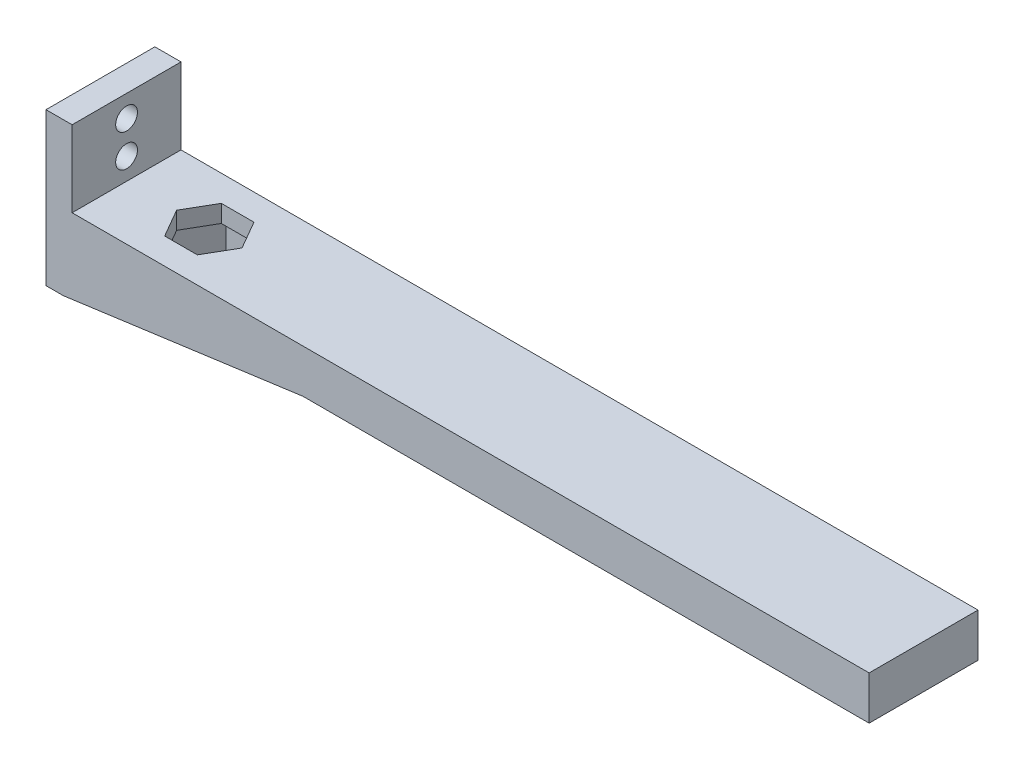
ISO-10303-21;
HEADER;
FILE_DESCRIPTION(('STEP AP214'),'2;1');
FILE_NAME('part.step','',(''),(''),'','','');
FILE_SCHEMA(('AUTOMOTIVE_DESIGN { 1 0 10303 214 1 1 1 1 }'));
ENDSEC;
DATA;
#1=APPLICATION_CONTEXT('core data for automotive mechanical design processes');
#2=APPLICATION_PROTOCOL_DEFINITION('international standard','automotive_design',2000,#1);
#3=PRODUCT_CONTEXT('',#1,'mechanical');
#4=PRODUCT('Part','Part','',(#3));
#5=PRODUCT_RELATED_PRODUCT_CATEGORY('part','',(#4));
#6=PRODUCT_DEFINITION_FORMATION('','',#4);
#7=PRODUCT_DEFINITION_CONTEXT('part definition',#1,'design');
#8=PRODUCT_DEFINITION('design','',#6,#7);
#9=PRODUCT_DEFINITION_SHAPE('','',#8);
#10=(LENGTH_UNIT() NAMED_UNIT(*) SI_UNIT(.MILLI.,.METRE.));
#11=(NAMED_UNIT(*) PLANE_ANGLE_UNIT() SI_UNIT($,.RADIAN.));
#12=(NAMED_UNIT(*) SI_UNIT($,.STERADIAN.) SOLID_ANGLE_UNIT());
#13=UNCERTAINTY_MEASURE_WITH_UNIT(LENGTH_MEASURE(1.E-05),#10,'distance_accuracy_value','');
#14=(GEOMETRIC_REPRESENTATION_CONTEXT(3) GLOBAL_UNCERTAINTY_ASSIGNED_CONTEXT((#13)) GLOBAL_UNIT_ASSIGNED_CONTEXT((#10,
#11,#12)) REPRESENTATION_CONTEXT('',''));
#15=CARTESIAN_POINT('',(0.,0.,0.));
#16=DIRECTION('',(0.,0.,1.));
#17=DIRECTION('',(1.,0.,0.));
#18=AXIS2_PLACEMENT_3D('',#15,#16,#17);
#19=CARTESIAN_POINT('',(4.,20.3125,8.17307692307693));
#20=DIRECTION('',(0.,0.,-1.));
#21=DIRECTION('',(0.,1.,0.));
#22=AXIS2_PLACEMENT_3D('',#19,#20,#21);
#23=PLANE('',#22);
#24=DIRECTION('',(-1.,0.,0.));
#25=VECTOR('',#24,1.);
#26=CARTESIAN_POINT('',(4.,-14.6875,8.17307692307692));
#27=LINE('',#26,#25);
#28=CARTESIAN_POINT('',(4.,-14.6875,8.17307692307693));
#29=VERTEX_POINT('',#28);
#30=CARTESIAN_POINT('',(0.,-14.6875,8.17307692307692));
#31=VERTEX_POINT('',#30);
#32=EDGE_CURVE('E332',#29,#31,#27,.T.);
#33=ORIENTED_EDGE('',*,*,#32,.F.);
#34=DIRECTION('',(0.990830168044299,0.135113204733314,0.));
#35=VECTOR('',#34,1.);
#36=CARTESIAN_POINT('',(4.,-14.6875,8.17307692307693));
#37=LINE('',#36,#35);
#38=CARTESIAN_POINT('',(59.,-7.1875,8.17307692307693));
#39=VERTEX_POINT('',#38);
#40=EDGE_CURVE('E194',#29,#39,#37,.T.);
#41=ORIENTED_EDGE('',*,*,#40,.T.);
#42=DIRECTION('',(-1.,0.,0.));
#43=VECTOR('',#42,1.);
#44=CARTESIAN_POINT('',(189.,-7.1875,8.17307692307693));
#45=LINE('',#44,#43);
#46=CARTESIAN_POINT('',(189.,-7.1875,8.17307692307693));
#47=VERTEX_POINT('',#46);
#48=EDGE_CURVE('E175',#47,#39,#45,.T.);
#49=ORIENTED_EDGE('',*,*,#48,.F.);
#50=DIRECTION('',(0.,-1.,0.));
#51=VECTOR('',#50,1.);
#52=CARTESIAN_POINT('',(189.,-7.1875,8.17307692307693));
#53=LINE('',#52,#51);
#54=CARTESIAN_POINT('',(189.,2.8125,8.17307692307693));
#55=VERTEX_POINT('',#54);
#56=EDGE_CURVE('E182',#55,#47,#53,.T.);
#57=ORIENTED_EDGE('',*,*,#56,.F.);
#58=DIRECTION('',(-1.,0.,0.));
#59=VECTOR('',#58,1.);
#60=CARTESIAN_POINT('',(59.,2.8125,8.17307692307693));
#61=LINE('',#60,#59);
#62=CARTESIAN_POINT('',(6.,2.8125,8.17307692307693));
#63=VERTEX_POINT('',#62);
#64=EDGE_CURVE('E296',#55,#63,#61,.T.);
#65=ORIENTED_EDGE('',*,*,#64,.T.);
#66=DIRECTION('',(0.,-1.,0.));
#67=VECTOR('',#66,1.);
#68=CARTESIAN_POINT('',(6.,20.3125,8.17307692307693));
#69=LINE('',#68,#67);
#70=CARTESIAN_POINT('',(6.,20.3125,8.17307692307693));
#71=VERTEX_POINT('',#70);
#72=EDGE_CURVE('E300',#71,#63,#69,.T.);
#73=ORIENTED_EDGE('',*,*,#72,.F.);
#74=DIRECTION('',(-1.,0.,0.));
#75=VECTOR('',#74,1.);
#76=CARTESIAN_POINT('',(4.,20.3125,8.17307692307693));
#77=LINE('',#76,#75);
#78=CARTESIAN_POINT('',(0.,20.3125,8.17307692307693));
#79=VERTEX_POINT('',#78);
#80=EDGE_CURVE('E315',#71,#79,#77,.T.);
#81=ORIENTED_EDGE('',*,*,#80,.T.);
#82=DIRECTION('',(0.,-1.,0.));
#83=VECTOR('',#82,1.);
#84=CARTESIAN_POINT('',(0.,20.3125,8.17307692307693));
#85=LINE('',#84,#83);
#86=EDGE_CURVE('E312',#79,#31,#85,.T.);
#87=ORIENTED_EDGE('',*,*,#86,.T.);
#88=EDGE_LOOP('',(#33,#41,#49,#57,#65,#73,#81,#87));
#89=FACE_BOUND('',#88,.T.);
#90=ADVANCED_FACE('F33',(#89),#23,.F.);
#91=CARTESIAN_POINT('',(4.,-14.6875,8.17307692307692));
#92=DIRECTION('',(0.,1.,0.));
#93=DIRECTION('',(0.,0.,1.));
#94=AXIS2_PLACEMENT_3D('',#91,#92,#93);
#95=PLANE('',#94);
#96=DIRECTION('',(0.,0.,-1.));
#97=VECTOR('',#96,1.);
#98=CARTESIAN_POINT('',(0.,-14.6875,8.17307692307692));
#99=LINE('',#98,#97);
#100=CARTESIAN_POINT('',(0.,-14.6875,-16.8269230769231));
#101=VERTEX_POINT('',#100);
#102=EDGE_CURVE('E319',#31,#101,#99,.T.);
#103=ORIENTED_EDGE('',*,*,#102,.T.);
#104=DIRECTION('',(-1.,0.,0.));
#105=VECTOR('',#104,1.);
#106=CARTESIAN_POINT('',(4.,-14.6875,-16.8269230769231));
#107=LINE('',#106,#105);
#108=CARTESIAN_POINT('',(4.,-14.6875,-16.8269230769231));
#109=VERTEX_POINT('',#108);
#110=EDGE_CURVE('E329',#109,#101,#107,.T.);
#111=ORIENTED_EDGE('',*,*,#110,.F.);
#112=DIRECTION('',(0.,0.,-1.));
#113=VECTOR('',#112,1.);
#114=CARTESIAN_POINT('',(4.,-14.6875,8.17307692307692));
#115=LINE('',#114,#113);
#116=EDGE_CURVE('E313',#29,#109,#115,.T.);
#117=ORIENTED_EDGE('',*,*,#116,.F.);
#118=ORIENTED_EDGE('',*,*,#32,.T.);
#119=EDGE_LOOP('',(#103,#111,#117,#118));
#120=FACE_BOUND('',#119,.T.);
#121=ADVANCED_FACE('F389',(#120),#95,.F.);
#122=CARTESIAN_POINT('',(4.,20.3125,-16.8269230769231));
#123=DIRECTION('',(0.,0.,1.));
#124=DIRECTION('',(1.,0.,0.));
#125=AXIS2_PLACEMENT_3D('',#122,#123,#124);
#126=PLANE('',#125);
#127=DIRECTION('',(0.,1.,0.));
#128=VECTOR('',#127,1.);
#129=CARTESIAN_POINT('',(0.,20.3125,-16.8269230769231));
#130=LINE('',#129,#128);
#131=CARTESIAN_POINT('',(0.,20.3125,-16.8269230769231));
#132=VERTEX_POINT('',#131);
#133=EDGE_CURVE('E321',#101,#132,#130,.T.);
#134=ORIENTED_EDGE('',*,*,#133,.T.);
#135=DIRECTION('',(-1.,0.,0.));
#136=VECTOR('',#135,1.);
#137=CARTESIAN_POINT('',(4.,20.3125,-16.8269230769231));
#138=LINE('',#137,#136);
#139=CARTESIAN_POINT('',(6.,20.3125,-16.8269230769231));
#140=VERTEX_POINT('',#139);
#141=EDGE_CURVE('E326',#140,#132,#138,.T.);
#142=ORIENTED_EDGE('',*,*,#141,.F.);
#143=DIRECTION('',(0.,1.,0.));
#144=VECTOR('',#143,1.);
#145=CARTESIAN_POINT('',(6.,20.3125,-16.8269230769231));
#146=LINE('',#145,#144);
#147=CARTESIAN_POINT('',(6.,2.8125,-16.8269230769231));
#148=VERTEX_POINT('',#147);
#149=EDGE_CURVE('E306',#148,#140,#146,.T.);
#150=ORIENTED_EDGE('',*,*,#149,.F.);
#151=DIRECTION('',(-1.,0.,0.));
#152=VECTOR('',#151,1.);
#153=CARTESIAN_POINT('',(59.,2.8125,-16.8269230769231));
#154=LINE('',#153,#152);
#155=CARTESIAN_POINT('',(189.,2.8125,-16.8269230769231));
#156=VERTEX_POINT('',#155);
#157=EDGE_CURVE('E298',#156,#148,#154,.T.);
#158=ORIENTED_EDGE('',*,*,#157,.F.);
#159=DIRECTION('',(0.,1.,0.));
#160=VECTOR('',#159,1.);
#161=CARTESIAN_POINT('',(189.,-7.1875,-16.8269230769231));
#162=LINE('',#161,#160);
#163=CARTESIAN_POINT('',(189.,-7.1875,-16.8269230769231));
#164=VERTEX_POINT('',#163);
#165=EDGE_CURVE('E181',#164,#156,#162,.T.);
#166=ORIENTED_EDGE('',*,*,#165,.F.);
#167=DIRECTION('',(-1.,0.,0.));
#168=VECTOR('',#167,1.);
#169=CARTESIAN_POINT('',(189.,-7.1875,-16.8269230769231));
#170=LINE('',#169,#168);
#171=CARTESIAN_POINT('',(59.,-7.1875,-16.8269230769231));
#172=VERTEX_POINT('',#171);
#173=EDGE_CURVE('E177',#164,#172,#170,.T.);
#174=ORIENTED_EDGE('',*,*,#173,.T.);
#175=DIRECTION('',(0.990830168044299,0.135113204733314,0.));
#176=VECTOR('',#175,1.);
#177=CARTESIAN_POINT('',(4.,-14.6875,-16.8269230769231));
#178=LINE('',#177,#176);
#179=EDGE_CURVE('E279',#109,#172,#178,.T.);
#180=ORIENTED_EDGE('',*,*,#179,.F.);
#181=ORIENTED_EDGE('',*,*,#110,.T.);
#182=EDGE_LOOP('',(#134,#142,#150,#158,#166,#174,#180,#181));
#183=FACE_BOUND('',#182,.T.);
#184=ADVANCED_FACE('F393',(#183),#126,.F.);
#185=CARTESIAN_POINT('',(4.,20.3125,8.17307692307693));
#186=DIRECTION('',(0.,-1.,0.));
#187=DIRECTION('',(0.,0.,-1.));
#188=AXIS2_PLACEMENT_3D('',#185,#186,#187);
#189=PLANE('',#188);
#190=DIRECTION('',(0.,0.,1.));
#191=VECTOR('',#190,1.);
#192=CARTESIAN_POINT('',(0.,20.3125,8.17307692307693));
#193=LINE('',#192,#191);
#194=EDGE_CURVE('E316',#132,#79,#193,.T.);
#195=ORIENTED_EDGE('',*,*,#194,.T.);
#196=ORIENTED_EDGE('',*,*,#80,.F.);
#197=DIRECTION('',(0.,0.,1.));
#198=VECTOR('',#197,1.);
#199=CARTESIAN_POINT('',(6.,20.3125,8.17307692307693));
#200=LINE('',#199,#198);
#201=EDGE_CURVE('E309',#140,#71,#200,.T.);
#202=ORIENTED_EDGE('',*,*,#201,.F.);
#203=ORIENTED_EDGE('',*,*,#141,.T.);
#204=EDGE_LOOP('',(#195,#196,#202,#203));
#205=FACE_BOUND('',#204,.T.);
#206=ADVANCED_FACE('F398',(#205),#189,.F.);
#207=CARTESIAN_POINT('',(0.,0.,0.));
#208=DIRECTION('',(1.,0.,0.));
#209=DIRECTION('',(0.,0.,-1.));
#210=AXIS2_PLACEMENT_3D('',#207,#208,#209);
#211=PLANE('',#210);
#212=CARTESIAN_POINT('',(0.,15.3125,-4.32692307692307));
#213=DIRECTION('',(1.,0.,0.));
#214=DIRECTION('',(0.,0.,-1.));
#215=AXIS2_PLACEMENT_3D('',#212,#213,#214);
#216=CIRCLE('',#215,2.5);
#217=CARTESIAN_POINT('',(0.,15.3125,-6.82692307692307));
#218=VERTEX_POINT('',#217);
#219=EDGE_CURVE('E291',#218,#218,#216,.T.);
#220=ORIENTED_EDGE('',*,*,#219,.T.);
#221=EDGE_LOOP('',(#220));
#222=FACE_BOUND('',#221,.T.);
#223=CARTESIAN_POINT('',(0.,7.8125,-4.32692307692307));
#224=DIRECTION('',(1.,0.,0.));
#225=DIRECTION('',(0.,0.,-1.));
#226=AXIS2_PLACEMENT_3D('',#223,#224,#225);
#227=CIRCLE('',#226,2.5);
#228=CARTESIAN_POINT('',(0.,7.8125,-6.82692307692307));
#229=VERTEX_POINT('',#228);
#230=EDGE_CURVE('E286',#229,#229,#227,.T.);
#231=ORIENTED_EDGE('',*,*,#230,.T.);
#232=EDGE_LOOP('',(#231));
#233=FACE_BOUND('',#232,.T.);
#234=ORIENTED_EDGE('',*,*,#86,.F.);
#235=ORIENTED_EDGE('',*,*,#194,.F.);
#236=ORIENTED_EDGE('',*,*,#133,.F.);
#237=ORIENTED_EDGE('',*,*,#102,.F.);
#238=EDGE_LOOP('',(#234,#235,#236,#237));
#239=FACE_BOUND('',#238,.T.);
#240=ADVANCED_FACE('F404',(#222,#233,#239),#211,.F.);
#241=CARTESIAN_POINT('',(6.,0.,0.));
#242=DIRECTION('',(1.,0.,0.));
#243=DIRECTION('',(0.,0.,-1.));
#244=AXIS2_PLACEMENT_3D('',#241,#242,#243);
#245=PLANE('',#244);
#246=CARTESIAN_POINT('',(6.,15.3125,-4.32692307692307));
#247=DIRECTION('',(1.,0.,0.));
#248=DIRECTION('',(0.,0.,-1.));
#249=AXIS2_PLACEMENT_3D('',#246,#247,#248);
#250=CIRCLE('',#249,2.5);
#251=CARTESIAN_POINT('',(6.,15.3125,-6.82692307692307));
#252=VERTEX_POINT('',#251);
#253=EDGE_CURVE('E283',#252,#252,#250,.T.);
#254=ORIENTED_EDGE('',*,*,#253,.F.);
#255=EDGE_LOOP('',(#254));
#256=FACE_BOUND('',#255,.T.);
#257=CARTESIAN_POINT('',(6.,7.8125,-4.32692307692307));
#258=DIRECTION('',(1.,0.,0.));
#259=DIRECTION('',(0.,0.,-1.));
#260=AXIS2_PLACEMENT_3D('',#257,#258,#259);
#261=CIRCLE('',#260,2.5);
#262=CARTESIAN_POINT('',(6.,7.8125,-6.82692307692307));
#263=VERTEX_POINT('',#262);
#264=EDGE_CURVE('E281',#263,#263,#261,.T.);
#265=ORIENTED_EDGE('',*,*,#264,.F.);
#266=EDGE_LOOP('',(#265));
#267=FACE_BOUND('',#266,.T.);
#268=ORIENTED_EDGE('',*,*,#72,.T.);
#269=DIRECTION('',(0.,0.,-1.));
#270=VECTOR('',#269,1.);
#271=CARTESIAN_POINT('',(6.,2.8125,8.17307692307693));
#272=LINE('',#271,#270);
#273=EDGE_CURVE('E303',#63,#148,#272,.T.);
#274=ORIENTED_EDGE('',*,*,#273,.T.);
#275=ORIENTED_EDGE('',*,*,#149,.T.);
#276=ORIENTED_EDGE('',*,*,#201,.T.);
#277=EDGE_LOOP('',(#268,#274,#275,#276));
#278=FACE_BOUND('',#277,.T.);
#279=ADVANCED_FACE('F408',(#256,#267,#278),#245,.T.);
#280=CARTESIAN_POINT('',(59.,2.8125,8.17307692307693));
#281=DIRECTION('',(0.,-1.,0.));
#282=DIRECTION('',(0.,0.,-1.));
#283=AXIS2_PLACEMENT_3D('',#280,#281,#282);
#284=PLANE('',#283);
#285=DIRECTION('',(-0.5,0.,-0.866025403784439));
#286=VECTOR('',#285,1.);
#287=CARTESIAN_POINT('',(32.5055534994651,2.8125,-4.32692307692308));
#288=LINE('',#287,#286);
#289=CARTESIAN_POINT('',(32.5055534994651,2.8125,-4.32692307692309));
#290=VERTEX_POINT('',#289);
#291=CARTESIAN_POINT('',(28.7527767497326,2.8125,-10.8269230769231));
#292=VERTEX_POINT('',#291);
#293=EDGE_CURVE('E254',#290,#292,#288,.T.);
#294=ORIENTED_EDGE('',*,*,#293,.F.);
#295=DIRECTION('',(0.5,0.,-0.866025403784439));
#296=VECTOR('',#295,1.);
#297=CARTESIAN_POINT('',(28.7527767497326,2.8125,2.17307692307693));
#298=LINE('',#297,#296);
#299=CARTESIAN_POINT('',(28.7527767497326,2.8125,2.17307692307693));
#300=VERTEX_POINT('',#299);
#301=EDGE_CURVE('E56',#300,#290,#298,.T.);
#302=ORIENTED_EDGE('',*,*,#301,.F.);
#303=DIRECTION('',(1.,0.,0.));
#304=VECTOR('',#303,1.);
#305=CARTESIAN_POINT('',(21.2472232502674,2.8125,2.17307692307693));
#306=LINE('',#305,#304);
#307=CARTESIAN_POINT('',(21.2472232502674,2.8125,2.17307692307693));
#308=VERTEX_POINT('',#307);
#309=EDGE_CURVE('E242',#308,#300,#306,.T.);
#310=ORIENTED_EDGE('',*,*,#309,.F.);
#311=DIRECTION('',(0.5,0.,0.866025403784439));
#312=VECTOR('',#311,1.);
#313=CARTESIAN_POINT('',(17.4944465005349,2.8125,-4.32692307692307));
#314=LINE('',#313,#312);
#315=CARTESIAN_POINT('',(17.4944465005349,2.8125,-4.32692307692307));
#316=VERTEX_POINT('',#315);
#317=EDGE_CURVE('E263',#316,#308,#314,.T.);
#318=ORIENTED_EDGE('',*,*,#317,.F.);
#319=DIRECTION('',(-0.5,0.,0.866025403784438));
#320=VECTOR('',#319,1.);
#321=CARTESIAN_POINT('',(21.2472232502674,2.8125,-10.8269230769231));
#322=LINE('',#321,#320);
#323=CARTESIAN_POINT('',(21.2472232502674,2.8125,-10.8269230769231));
#324=VERTEX_POINT('',#323);
#325=EDGE_CURVE('E260',#324,#316,#322,.T.);
#326=ORIENTED_EDGE('',*,*,#325,.F.);
#327=DIRECTION('',(-1.,0.,0.));
#328=VECTOR('',#327,1.);
#329=CARTESIAN_POINT('',(28.7527767497326,2.8125,-10.8269230769231));
#330=LINE('',#329,#328);
#331=EDGE_CURVE('E257',#292,#324,#330,.T.);
#332=ORIENTED_EDGE('',*,*,#331,.F.);
#333=EDGE_LOOP('',(#294,#302,#310,#318,#326,#332));
#334=FACE_BOUND('',#333,.T.);
#335=ORIENTED_EDGE('',*,*,#273,.F.);
#336=ORIENTED_EDGE('',*,*,#64,.F.);
#337=DIRECTION('',(0.,0.,1.));
#338=VECTOR('',#337,1.);
#339=CARTESIAN_POINT('',(189.,2.8125,8.17307692307693));
#340=LINE('',#339,#338);
#341=EDGE_CURVE('E188',#156,#55,#340,.T.);
#342=ORIENTED_EDGE('',*,*,#341,.F.);
#343=ORIENTED_EDGE('',*,*,#157,.T.);
#344=EDGE_LOOP('',(#335,#336,#342,#343));
#345=FACE_BOUND('',#344,.T.);
#346=ADVANCED_FACE('F412',(#334,#345),#284,.F.);
#347=CARTESIAN_POINT('',(-49.,7.8125,-4.32692307692307));
#348=DIRECTION('',(1.,0.,0.));
#349=DIRECTION('',(0.,0.,-1.));
#350=AXIS2_PLACEMENT_3D('',#347,#348,#349);
#351=CYLINDRICAL_SURFACE('',#350,2.5);
#352=ORIENTED_EDGE('',*,*,#264,.T.);
#353=EDGE_LOOP('',(#352));
#354=FACE_BOUND('',#353,.T.);
#355=ORIENTED_EDGE('',*,*,#230,.F.);
#356=EDGE_LOOP('',(#355));
#357=FACE_BOUND('',#356,.T.);
#358=ADVANCED_FACE('F416',(#354,#357),#351,.F.);
#359=CARTESIAN_POINT('',(-49.,15.3125,-4.32692307692307));
#360=DIRECTION('',(1.,0.,0.));
#361=DIRECTION('',(0.,0.,-1.));
#362=AXIS2_PLACEMENT_3D('',#359,#360,#361);
#363=CYLINDRICAL_SURFACE('',#362,2.5);
#364=ORIENTED_EDGE('',*,*,#253,.T.);
#365=EDGE_LOOP('',(#364));
#366=FACE_BOUND('',#365,.T.);
#367=ORIENTED_EDGE('',*,*,#219,.F.);
#368=EDGE_LOOP('',(#367));
#369=FACE_BOUND('',#368,.T.);
#370=ADVANCED_FACE('F420',(#366,#369),#363,.F.);
#371=CARTESIAN_POINT('',(4.,-14.6875,-16.8269230769231));
#372=DIRECTION('',(0.135113204733314,-0.990830168044299,0.));
#373=DIRECTION('',(0.990830168044299,0.135113204733314,0.));
#374=AXIS2_PLACEMENT_3D('',#371,#372,#373);
#375=PLANE('',#374);
#376=DIRECTION('',(0.49884184634077,0.0680238881373777,0.864019422803681));
#377=VECTOR('',#376,1.);
#378=CARTESIAN_POINT('',(22.1338723742525,-12.2146992216928,-27.4912017456946));
#379=LINE('',#378,#377);
#380=CARTESIAN_POINT('',(30.2538874496256,-11.1074244386874,-13.4269230769231));
#381=VERTEX_POINT('',#380);
#382=CARTESIAN_POINT('',(35.5077748992512,-10.3909852410112,-4.32692307692308));
#383=VERTEX_POINT('',#382);
#384=EDGE_CURVE('E11',#381,#383,#379,.T.);
#385=ORIENTED_EDGE('',*,*,#384,.F.);
#386=DIRECTION('',(0.990830168044299,0.135113204733314,0.));
#387=VECTOR('',#386,1.);
#388=CARTESIAN_POINT('',(4.,-14.6875,-13.4269230769231));
#389=LINE('',#388,#387);
#390=CARTESIAN_POINT('',(19.7461125503744,-12.5403028340399,-13.4269230769231));
#391=VERTEX_POINT('',#390);
#392=EDGE_CURVE('E335',#391,#381,#389,.T.);
#393=ORIENTED_EDGE('',*,*,#392,.F.);
#394=DIRECTION('',(0.49884184634077,0.0680238881373778,-0.86401942280368));
#395=VECTOR('',#394,1.);
#396=CARTESIAN_POINT('',(17.2203692709918,-12.8847223721375,-9.0522073901567));
#397=LINE('',#396,#395);
#398=CARTESIAN_POINT('',(14.4922251007488,-13.2567420317161,-4.32692307692308));
#399=VERTEX_POINT('',#398);
#400=EDGE_CURVE('E337',#399,#391,#397,.T.);
#401=ORIENTED_EDGE('',*,*,#400,.F.);
#402=DIRECTION('',(-0.49884184634077,-0.0680238881373777,-0.864019422803681));
#403=VECTOR('',#402,1.);
#404=CARTESIAN_POINT('',(6.44514316734992,-14.3540713862705,-18.2648778382396));
#405=LINE('',#404,#403);
#406=CARTESIAN_POINT('',(19.7461125503744,-12.5403028340399,4.77307692307692));
#407=VERTEX_POINT('',#406);
#408=EDGE_CURVE('E339',#407,#399,#405,.T.);
#409=ORIENTED_EDGE('',*,*,#408,.F.);
#410=DIRECTION('',(-0.990830168044299,-0.135113204733314,0.));
#411=VECTOR('',#410,1.);
#412=CARTESIAN_POINT('',(4.,-14.6875,4.77307692307692));
#413=LINE('',#412,#411);
#414=CARTESIAN_POINT('',(30.2538874496256,-11.1074244386874,4.77307692307692));
#415=VERTEX_POINT('',#414);
#416=EDGE_CURVE('E341',#415,#407,#413,.T.);
#417=ORIENTED_EDGE('',*,*,#416,.F.);
#418=DIRECTION('',(-0.49884184634077,-0.0680238881373777,0.86401942280368));
#419=VECTOR('',#418,1.);
#420=CARTESIAN_POINT('',(32.9090984778943,-10.7453502075599,0.174116517298303));
#421=LINE('',#420,#419);
#422=EDGE_CURVE('E41',#383,#415,#421,.T.);
#423=ORIENTED_EDGE('',*,*,#422,.F.);
#424=EDGE_LOOP('',(#385,#393,#401,#409,#417,#423));
#425=FACE_BOUND('',#424,.T.);
#426=ORIENTED_EDGE('',*,*,#40,.F.);
#427=ORIENTED_EDGE('',*,*,#116,.T.);
#428=ORIENTED_EDGE('',*,*,#179,.T.);
#429=DIRECTION('',(0.,0.,-1.));
#430=VECTOR('',#429,1.);
#431=CARTESIAN_POINT('',(59.,-7.1875,8.17307692307693));
#432=LINE('',#431,#430);
#433=EDGE_CURVE('E294',#39,#172,#432,.T.);
#434=ORIENTED_EDGE('',*,*,#433,.F.);
#435=EDGE_LOOP('',(#426,#427,#428,#434));
#436=FACE_BOUND('',#435,.T.);
#437=ADVANCED_FACE('F356',(#425,#436),#375,.T.);
#438=CARTESIAN_POINT('',(28.7527767497326,-1.1875,2.17307692307693));
#439=DIRECTION('',(0.866025403784439,0.,0.5));
#440=DIRECTION('',(0.5,0.,-0.866025403784439));
#441=AXIS2_PLACEMENT_3D('',#438,#439,#440);
#442=PLANE('',#441);
#443=ORIENTED_EDGE('',*,*,#301,.T.);
#444=DIRECTION('',(0.,1.,0.));
#445=VECTOR('',#444,1.);
#446=CARTESIAN_POINT('',(32.5055534994651,-1.1875,-4.32692307692308));
#447=LINE('',#446,#445);
#448=CARTESIAN_POINT('',(32.5055534994651,-1.1875,-4.32692307692308));
#449=VERTEX_POINT('',#448);
#450=EDGE_CURVE('E252',#449,#290,#447,.T.);
#451=ORIENTED_EDGE('',*,*,#450,.F.);
#452=DIRECTION('',(0.5,0.,-0.866025403784439));
#453=VECTOR('',#452,1.);
#454=CARTESIAN_POINT('',(28.7527767497326,-1.1875,2.17307692307693));
#455=LINE('',#454,#453);
#456=CARTESIAN_POINT('',(28.7527767497326,-1.1875,2.17307692307693));
#457=VERTEX_POINT('',#456);
#458=EDGE_CURVE('E239',#457,#449,#455,.T.);
#459=ORIENTED_EDGE('',*,*,#458,.F.);
#460=DIRECTION('',(0.,1.,0.));
#461=VECTOR('',#460,1.);
#462=CARTESIAN_POINT('',(28.7527767497326,-1.1875,2.17307692307693));
#463=LINE('',#462,#461);
#464=EDGE_CURVE('E268',#457,#300,#463,.T.);
#465=ORIENTED_EDGE('',*,*,#464,.T.);
#466=EDGE_LOOP('',(#443,#451,#459,#465));
#467=FACE_BOUND('',#466,.T.);
#468=ADVANCED_FACE('F427',(#467),#442,.F.);
#469=CARTESIAN_POINT('',(21.2472232502674,-1.1875,2.17307692307693));
#470=DIRECTION('',(0.,0.,1.));
#471=DIRECTION('',(1.,0.,0.));
#472=AXIS2_PLACEMENT_3D('',#469,#470,#471);
#473=PLANE('',#472);
#474=ORIENTED_EDGE('',*,*,#309,.T.);
#475=ORIENTED_EDGE('',*,*,#464,.F.);
#476=DIRECTION('',(1.,0.,0.));
#477=VECTOR('',#476,1.);
#478=CARTESIAN_POINT('',(21.2472232502674,-1.1875,2.17307692307693));
#479=LINE('',#478,#477);
#480=CARTESIAN_POINT('',(21.2472232502674,-1.1875,2.17307692307693));
#481=VERTEX_POINT('',#480);
#482=EDGE_CURVE('E250',#481,#457,#479,.T.);
#483=ORIENTED_EDGE('',*,*,#482,.F.);
#484=DIRECTION('',(0.,1.,0.));
#485=VECTOR('',#484,1.);
#486=CARTESIAN_POINT('',(21.2472232502674,-1.1875,2.17307692307693));
#487=LINE('',#486,#485);
#488=EDGE_CURVE('E270',#481,#308,#487,.T.);
#489=ORIENTED_EDGE('',*,*,#488,.T.);
#490=EDGE_LOOP('',(#474,#475,#483,#489));
#491=FACE_BOUND('',#490,.T.);
#492=ADVANCED_FACE('F429',(#491),#473,.F.);
#493=CARTESIAN_POINT('',(17.4944465005349,-1.1875,-4.32692307692307));
#494=DIRECTION('',(-0.866025403784439,0.,0.5));
#495=DIRECTION('',(0.5,0.,0.866025403784439));
#496=AXIS2_PLACEMENT_3D('',#493,#494,#495);
#497=PLANE('',#496);
#498=ORIENTED_EDGE('',*,*,#317,.T.);
#499=ORIENTED_EDGE('',*,*,#488,.F.);
#500=DIRECTION('',(0.5,0.,0.866025403784439));
#501=VECTOR('',#500,1.);
#502=CARTESIAN_POINT('',(17.4944465005349,-1.1875,-4.32692307692307));
#503=LINE('',#502,#501);
#504=CARTESIAN_POINT('',(17.4944465005349,-1.1875,-4.32692307692307));
#505=VERTEX_POINT('',#504);
#506=EDGE_CURVE('E248',#505,#481,#503,.T.);
#507=ORIENTED_EDGE('',*,*,#506,.F.);
#508=DIRECTION('',(0.,1.,0.));
#509=VECTOR('',#508,1.);
#510=CARTESIAN_POINT('',(17.4944465005349,-1.1875,-4.32692307692307));
#511=LINE('',#510,#509);
#512=EDGE_CURVE('E272',#505,#316,#511,.T.);
#513=ORIENTED_EDGE('',*,*,#512,.T.);
#514=EDGE_LOOP('',(#498,#499,#507,#513));
#515=FACE_BOUND('',#514,.T.);
#516=ADVANCED_FACE('F437',(#515),#497,.F.);
#517=CARTESIAN_POINT('',(21.2472232502674,-1.1875,-10.8269230769231));
#518=DIRECTION('',(-0.866025403784439,0.,-0.5));
#519=DIRECTION('',(-0.5,0.,0.866025403784439));
#520=AXIS2_PLACEMENT_3D('',#517,#518,#519);
#521=PLANE('',#520);
#522=ORIENTED_EDGE('',*,*,#325,.T.);
#523=ORIENTED_EDGE('',*,*,#512,.F.);
#524=DIRECTION('',(-0.5,0.,0.866025403784438));
#525=VECTOR('',#524,1.);
#526=CARTESIAN_POINT('',(21.2472232502674,-1.1875,-10.8269230769231));
#527=LINE('',#526,#525);
#528=CARTESIAN_POINT('',(21.2472232502674,-1.1875,-10.8269230769231));
#529=VERTEX_POINT('',#528);
#530=EDGE_CURVE('E246',#529,#505,#527,.T.);
#531=ORIENTED_EDGE('',*,*,#530,.F.);
#532=DIRECTION('',(0.,1.,0.));
#533=VECTOR('',#532,1.);
#534=CARTESIAN_POINT('',(21.2472232502674,-1.1875,-10.8269230769231));
#535=LINE('',#534,#533);
#536=EDGE_CURVE('E274',#529,#324,#535,.T.);
#537=ORIENTED_EDGE('',*,*,#536,.T.);
#538=EDGE_LOOP('',(#522,#523,#531,#537));
#539=FACE_BOUND('',#538,.T.);
#540=ADVANCED_FACE('F433',(#539),#521,.F.);
#541=CARTESIAN_POINT('',(28.7527767497326,-1.1875,-10.8269230769231));
#542=DIRECTION('',(0.,0.,-1.));
#543=DIRECTION('',(-1.,0.,0.));
#544=AXIS2_PLACEMENT_3D('',#541,#542,#543);
#545=PLANE('',#544);
#546=ORIENTED_EDGE('',*,*,#331,.T.);
#547=ORIENTED_EDGE('',*,*,#536,.F.);
#548=DIRECTION('',(-1.,0.,0.));
#549=VECTOR('',#548,1.);
#550=CARTESIAN_POINT('',(28.7527767497326,-1.1875,-10.8269230769231));
#551=LINE('',#550,#549);
#552=CARTESIAN_POINT('',(28.7527767497326,-1.1875,-10.8269230769231));
#553=VERTEX_POINT('',#552);
#554=EDGE_CURVE('E244',#553,#529,#551,.T.);
#555=ORIENTED_EDGE('',*,*,#554,.F.);
#556=DIRECTION('',(0.,1.,0.));
#557=VECTOR('',#556,1.);
#558=CARTESIAN_POINT('',(28.7527767497326,-1.1875,-10.8269230769231));
#559=LINE('',#558,#557);
#560=EDGE_CURVE('E276',#553,#292,#559,.T.);
#561=ORIENTED_EDGE('',*,*,#560,.T.);
#562=EDGE_LOOP('',(#546,#547,#555,#561));
#563=FACE_BOUND('',#562,.T.);
#564=ADVANCED_FACE('F383',(#563),#545,.F.);
#565=CARTESIAN_POINT('',(32.5055534994651,-1.1875,-4.32692307692308));
#566=DIRECTION('',(0.866025403784439,0.,-0.5));
#567=DIRECTION('',(-0.5,0.,-0.866025403784439));
#568=AXIS2_PLACEMENT_3D('',#565,#566,#567);
#569=PLANE('',#568);
#570=ORIENTED_EDGE('',*,*,#293,.T.);
#571=ORIENTED_EDGE('',*,*,#560,.F.);
#572=DIRECTION('',(-0.5,0.,-0.866025403784439));
#573=VECTOR('',#572,1.);
#574=CARTESIAN_POINT('',(32.5055534994651,-1.1875,-4.32692307692308));
#575=LINE('',#574,#573);
#576=EDGE_CURVE('E241',#449,#553,#575,.T.);
#577=ORIENTED_EDGE('',*,*,#576,.F.);
#578=ORIENTED_EDGE('',*,*,#450,.T.);
#579=EDGE_LOOP('',(#570,#571,#577,#578));
#580=FACE_BOUND('',#579,.T.);
#581=ADVANCED_FACE('F376',(#580),#569,.F.);
#582=CARTESIAN_POINT('',(35.5077748992512,-46.1875,-4.32692307692308));
#583=DIRECTION('',(0.866025403784439,0.,-0.5));
#584=DIRECTION('',(-0.5,0.,-0.866025403784439));
#585=AXIS2_PLACEMENT_3D('',#582,#583,#584);
#586=PLANE('',#585);
#587=ORIENTED_EDGE('',*,*,#384,.T.);
#588=DIRECTION('',(0.,1.,0.));
#589=VECTOR('',#588,1.);
#590=CARTESIAN_POINT('',(35.5077748992512,-46.1875,-4.32692307692308));
#591=LINE('',#590,#589);
#592=CARTESIAN_POINT('',(35.5077748992512,-1.1875,-4.32692307692308));
#593=VERTEX_POINT('',#592);
#594=EDGE_CURVE('E221',#383,#593,#591,.T.);
#595=ORIENTED_EDGE('',*,*,#594,.T.);
#596=DIRECTION('',(-0.5,0.,-0.866025403784439));
#597=VECTOR('',#596,1.);
#598=CARTESIAN_POINT('',(35.5077748992512,-1.1875,-4.32692307692308));
#599=LINE('',#598,#597);
#600=CARTESIAN_POINT('',(30.2538874496256,-1.1875,-13.4269230769231));
#601=VERTEX_POINT('',#600);
#602=EDGE_CURVE('E203',#593,#601,#599,.T.);
#603=ORIENTED_EDGE('',*,*,#602,.T.);
#604=DIRECTION('',(0.,1.,0.));
#605=VECTOR('',#604,1.);
#606=CARTESIAN_POINT('',(30.2538874496256,-46.1875,-13.4269230769231));
#607=LINE('',#606,#605);
#608=EDGE_CURVE('E220',#381,#601,#607,.T.);
#609=ORIENTED_EDGE('',*,*,#608,.F.);
#610=EDGE_LOOP('',(#587,#595,#603,#609));
#611=FACE_BOUND('',#610,.T.);
#612=ADVANCED_FACE('F374',(#611),#586,.F.);
#613=CARTESIAN_POINT('',(30.2538874496256,-46.1875,4.77307692307692));
#614=DIRECTION('',(0.866025403784439,0.,0.5));
#615=DIRECTION('',(0.5,0.,-0.866025403784439));
#616=AXIS2_PLACEMENT_3D('',#613,#614,#615);
#617=PLANE('',#616);
#618=ORIENTED_EDGE('',*,*,#422,.T.);
#619=DIRECTION('',(0.,1.,0.));
#620=VECTOR('',#619,1.);
#621=CARTESIAN_POINT('',(30.2538874496256,-46.1875,4.77307692307692));
#622=LINE('',#621,#620);
#623=CARTESIAN_POINT('',(30.2538874496256,-1.1875,4.77307692307692));
#624=VERTEX_POINT('',#623);
#625=EDGE_CURVE('E224',#415,#624,#622,.T.);
#626=ORIENTED_EDGE('',*,*,#625,.T.);
#627=DIRECTION('',(0.5,0.,-0.866025403784439));
#628=VECTOR('',#627,1.);
#629=CARTESIAN_POINT('',(30.2538874496256,-1.1875,4.77307692307692));
#630=LINE('',#629,#628);
#631=EDGE_CURVE('E217',#624,#593,#630,.T.);
#632=ORIENTED_EDGE('',*,*,#631,.T.);
#633=ORIENTED_EDGE('',*,*,#594,.F.);
#634=EDGE_LOOP('',(#618,#626,#632,#633));
#635=FACE_BOUND('',#634,.T.);
#636=ADVANCED_FACE('F346',(#635),#617,.F.);
#637=CARTESIAN_POINT('',(19.7461125503744,-46.1875,4.77307692307692));
#638=DIRECTION('',(0.,0.,1.));
#639=DIRECTION('',(1.,0.,0.));
#640=AXIS2_PLACEMENT_3D('',#637,#638,#639);
#641=PLANE('',#640);
#642=ORIENTED_EDGE('',*,*,#416,.T.);
#643=DIRECTION('',(0.,1.,0.));
#644=VECTOR('',#643,1.);
#645=CARTESIAN_POINT('',(19.7461125503744,-46.1875,4.77307692307692));
#646=LINE('',#645,#644);
#647=CARTESIAN_POINT('',(19.7461125503744,-1.1875,4.77307692307692));
#648=VERTEX_POINT('',#647);
#649=EDGE_CURVE('E226',#407,#648,#646,.T.);
#650=ORIENTED_EDGE('',*,*,#649,.T.);
#651=DIRECTION('',(1.,0.,0.));
#652=VECTOR('',#651,1.);
#653=CARTESIAN_POINT('',(19.7461125503744,-1.1875,4.77307692307692));
#654=LINE('',#653,#652);
#655=EDGE_CURVE('E214',#648,#624,#654,.T.);
#656=ORIENTED_EDGE('',*,*,#655,.T.);
#657=ORIENTED_EDGE('',*,*,#625,.F.);
#658=EDGE_LOOP('',(#642,#650,#656,#657));
#659=FACE_BOUND('',#658,.T.);
#660=ADVANCED_FACE('F351',(#659),#641,.F.);
#661=CARTESIAN_POINT('',(14.4922251007488,-46.1875,-4.32692307692308));
#662=DIRECTION('',(-0.866025403784439,0.,0.5));
#663=DIRECTION('',(0.5,0.,0.866025403784439));
#664=AXIS2_PLACEMENT_3D('',#661,#662,#663);
#665=PLANE('',#664);
#666=ORIENTED_EDGE('',*,*,#408,.T.);
#667=DIRECTION('',(0.,1.,0.));
#668=VECTOR('',#667,1.);
#669=CARTESIAN_POINT('',(14.4922251007488,-46.1875,-4.32692307692308));
#670=LINE('',#669,#668);
#671=CARTESIAN_POINT('',(14.4922251007488,-1.1875,-4.32692307692308));
#672=VERTEX_POINT('',#671);
#673=EDGE_CURVE('E228',#399,#672,#670,.T.);
#674=ORIENTED_EDGE('',*,*,#673,.T.);
#675=DIRECTION('',(0.5,0.,0.866025403784439));
#676=VECTOR('',#675,1.);
#677=CARTESIAN_POINT('',(14.4922251007488,-1.1875,-4.32692307692308));
#678=LINE('',#677,#676);
#679=EDGE_CURVE('E211',#672,#648,#678,.T.);
#680=ORIENTED_EDGE('',*,*,#679,.T.);
#681=ORIENTED_EDGE('',*,*,#649,.F.);
#682=EDGE_LOOP('',(#666,#674,#680,#681));
#683=FACE_BOUND('',#682,.T.);
#684=ADVANCED_FACE('F362',(#683),#665,.F.);
#685=CARTESIAN_POINT('',(19.7461125503744,-46.1875,-13.4269230769231));
#686=DIRECTION('',(-0.866025403784439,0.,-0.5));
#687=DIRECTION('',(-0.5,0.,0.866025403784439));
#688=AXIS2_PLACEMENT_3D('',#685,#686,#687);
#689=PLANE('',#688);
#690=ORIENTED_EDGE('',*,*,#400,.T.);
#691=DIRECTION('',(0.,1.,0.));
#692=VECTOR('',#691,1.);
#693=CARTESIAN_POINT('',(19.7461125503744,-46.1875,-13.4269230769231));
#694=LINE('',#693,#692);
#695=CARTESIAN_POINT('',(19.7461125503744,-1.1875,-13.4269230769231));
#696=VERTEX_POINT('',#695);
#697=EDGE_CURVE('E48',#391,#696,#694,.T.);
#698=ORIENTED_EDGE('',*,*,#697,.T.);
#699=DIRECTION('',(-0.5,0.,0.866025403784439));
#700=VECTOR('',#699,1.);
#701=CARTESIAN_POINT('',(19.7461125503744,-1.1875,-13.4269230769231));
#702=LINE('',#701,#700);
#703=EDGE_CURVE('E208',#696,#672,#702,.T.);
#704=ORIENTED_EDGE('',*,*,#703,.T.);
#705=ORIENTED_EDGE('',*,*,#673,.F.);
#706=EDGE_LOOP('',(#690,#698,#704,#705));
#707=FACE_BOUND('',#706,.T.);
#708=ADVANCED_FACE('F365',(#707),#689,.F.);
#709=CARTESIAN_POINT('',(30.2538874496256,-46.1875,-13.4269230769231));
#710=DIRECTION('',(0.,0.,-1.));
#711=DIRECTION('',(-1.,0.,0.));
#712=AXIS2_PLACEMENT_3D('',#709,#710,#711);
#713=PLANE('',#712);
#714=ORIENTED_EDGE('',*,*,#392,.T.);
#715=ORIENTED_EDGE('',*,*,#608,.T.);
#716=DIRECTION('',(-1.,0.,0.));
#717=VECTOR('',#716,1.);
#718=CARTESIAN_POINT('',(30.2538874496256,-1.1875,-13.4269230769231));
#719=LINE('',#718,#717);
#720=EDGE_CURVE('E206',#601,#696,#719,.T.);
#721=ORIENTED_EDGE('',*,*,#720,.T.);
#722=ORIENTED_EDGE('',*,*,#697,.F.);
#723=EDGE_LOOP('',(#714,#715,#721,#722));
#724=FACE_BOUND('',#723,.T.);
#725=ADVANCED_FACE('F371',(#724),#713,.F.);
#726=CARTESIAN_POINT('',(0.,-1.1875,0.));
#727=DIRECTION('',(0.,1.,0.));
#728=DIRECTION('',(0.,0.,1.));
#729=AXIS2_PLACEMENT_3D('',#726,#727,#728);
#730=PLANE('',#729);
#731=ORIENTED_EDGE('',*,*,#458,.T.);
#732=ORIENTED_EDGE('',*,*,#576,.T.);
#733=ORIENTED_EDGE('',*,*,#554,.T.);
#734=ORIENTED_EDGE('',*,*,#530,.T.);
#735=ORIENTED_EDGE('',*,*,#506,.T.);
#736=ORIENTED_EDGE('',*,*,#482,.T.);
#737=EDGE_LOOP('',(#731,#732,#733,#734,#735,#736));
#738=FACE_BOUND('',#737,.T.);
#739=ORIENTED_EDGE('',*,*,#602,.F.);
#740=ORIENTED_EDGE('',*,*,#631,.F.);
#741=ORIENTED_EDGE('',*,*,#655,.F.);
#742=ORIENTED_EDGE('',*,*,#679,.F.);
#743=ORIENTED_EDGE('',*,*,#703,.F.);
#744=ORIENTED_EDGE('',*,*,#720,.F.);
#745=EDGE_LOOP('',(#739,#740,#741,#742,#743,#744));
#746=FACE_BOUND('',#745,.T.);
#747=ADVANCED_FACE('F370',(#738,#746),#730,.F.);
#748=CARTESIAN_POINT('',(189.,-7.1875,8.17307692307693));
#749=DIRECTION('',(0.,1.,0.));
#750=DIRECTION('',(0.,0.,1.));
#751=AXIS2_PLACEMENT_3D('',#748,#749,#750);
#752=PLANE('',#751);
#753=ORIENTED_EDGE('',*,*,#433,.T.);
#754=ORIENTED_EDGE('',*,*,#173,.F.);
#755=DIRECTION('',(0.,0.,-1.));
#756=VECTOR('',#755,1.);
#757=CARTESIAN_POINT('',(189.,-7.1875,8.17307692307693));
#758=LINE('',#757,#756);
#759=EDGE_CURVE('E170',#47,#164,#758,.T.);
#760=ORIENTED_EDGE('',*,*,#759,.F.);
#761=ORIENTED_EDGE('',*,*,#48,.T.);
#762=EDGE_LOOP('',(#753,#754,#760,#761));
#763=FACE_BOUND('',#762,.T.);
#764=ADVANCED_FACE('F173',(#763),#752,.F.);
#765=CARTESIAN_POINT('',(189.,0.,0.));
#766=DIRECTION('',(-1.,0.,0.));
#767=DIRECTION('',(0.,0.,1.));
#768=AXIS2_PLACEMENT_3D('',#765,#766,#767);
#769=PLANE('',#768);
#770=ORIENTED_EDGE('',*,*,#56,.T.);
#771=ORIENTED_EDGE('',*,*,#759,.T.);
#772=ORIENTED_EDGE('',*,*,#165,.T.);
#773=ORIENTED_EDGE('',*,*,#341,.T.);
#774=EDGE_LOOP('',(#770,#771,#772,#773));
#775=FACE_BOUND('',#774,.T.);
#776=ADVANCED_FACE('F186',(#775),#769,.F.);
#777=CLOSED_SHELL('',(#90,#121,#184,#206,#240,#279,#346,#358,#370,#437,#468,#492,#516,#540,#564,
#581,#612,#636,#660,#684,#708,#725,#747,#764,#776));
#778=CARTESIAN_POINT('',(39.,-2.1875,1.92307692307692));
#779=DIRECTION('',(1.,0.,0.));
#780=DIRECTION('',(0.,0.,-1.));
#781=AXIS2_PLACEMENT_3D('',#778,#779,#780);
#782=PLANE('',#781);
#783=CARTESIAN_POINT('',(39.,-2.1875,1.92307692307692));
#784=DIRECTION('',(1.,0.,0.));
#785=DIRECTION('',(0.,0.,-1.));
#786=AXIS2_PLACEMENT_3D('',#783,#784,#785);
#787=CIRCLE('',#786,2.);
#788=CARTESIAN_POINT('',(39.,-2.1875,-0.0769230769230751));
#789=VERTEX_POINT('',#788);
#790=EDGE_CURVE('E232',#789,#789,#787,.T.);
#791=ORIENTED_EDGE('',*,*,#790,.T.);
#792=EDGE_LOOP('',(#791));
#793=FACE_BOUND('',#792,.T.);
#794=ADVANCED_FACE('F459',(#793),#782,.T.);
#795=CARTESIAN_POINT('',(39.,-2.1875,1.92307692307692));
#796=DIRECTION('',(1.,0.,0.));
#797=DIRECTION('',(0.,0.,-1.));
#798=AXIS2_PLACEMENT_3D('',#795,#796,#797);
#799=CYLINDRICAL_SURFACE('',#798,2.);
#800=ORIENTED_EDGE('',*,*,#790,.F.);
#801=EDGE_LOOP('',(#800));
#802=FACE_BOUND('',#801,.T.);
#803=CARTESIAN_POINT('',(59.,-2.1875,1.92307692307692));
#804=DIRECTION('',(1.,0.,0.));
#805=DIRECTION('',(0.,0.,-1.));
#806=AXIS2_PLACEMENT_3D('',#803,#804,#805);
#807=CIRCLE('',#806,2.);
#808=CARTESIAN_POINT('',(59.,-2.1875,-0.0769230769230751));
#809=VERTEX_POINT('',#808);
#810=EDGE_CURVE('E198',#809,#809,#807,.T.);
#811=ORIENTED_EDGE('',*,*,#810,.T.);
#812=EDGE_LOOP('',(#811));
#813=FACE_BOUND('',#812,.T.);
#814=ADVANCED_FACE('F456',(#802,#813),#799,.F.);
#815=CARTESIAN_POINT('',(59.,0.,0.));
#816=DIRECTION('',(-1.,0.,0.));
#817=DIRECTION('',(0.,0.,1.));
#818=AXIS2_PLACEMENT_3D('',#815,#816,#817);
#819=PLANE('',#818);
#820=ORIENTED_EDGE('',*,*,#810,.F.);
#821=EDGE_LOOP('',(#820));
#822=FACE_BOUND('',#821,.T.);
#823=ADVANCED_FACE('F458',(#822),#819,.T.);
#824=CLOSED_SHELL('',(#794,#814,#823));
#825=CARTESIAN_POINT('',(39.,-2.1875,-10.5769230769231));
#826=DIRECTION('',(1.,0.,0.));
#827=DIRECTION('',(0.,0.,-1.));
#828=AXIS2_PLACEMENT_3D('',#825,#826,#827);
#829=PLANE('',#828);
#830=CARTESIAN_POINT('',(39.,-2.1875,-10.5769230769231));
#831=DIRECTION('',(1.,0.,0.));
#832=DIRECTION('',(0.,0.,-1.));
#833=AXIS2_PLACEMENT_3D('',#830,#831,#832);
#834=CIRCLE('',#833,2.);
#835=CARTESIAN_POINT('',(39.,-2.1875,-12.5769230769231));
#836=VERTEX_POINT('',#835);
#837=EDGE_CURVE('E223',#836,#836,#834,.T.);
#838=ORIENTED_EDGE('',*,*,#837,.T.);
#839=EDGE_LOOP('',(#838));
#840=FACE_BOUND('',#839,.T.);
#841=ADVANCED_FACE('F449',(#840),#829,.T.);
#842=CARTESIAN_POINT('',(39.,-2.1875,-10.5769230769231));
#843=DIRECTION('',(1.,0.,0.));
#844=DIRECTION('',(0.,0.,-1.));
#845=AXIS2_PLACEMENT_3D('',#842,#843,#844);
#846=CYLINDRICAL_SURFACE('',#845,2.);
#847=ORIENTED_EDGE('',*,*,#837,.F.);
#848=EDGE_LOOP('',(#847));
#849=FACE_BOUND('',#848,.T.);
#850=CARTESIAN_POINT('',(59.,-2.1875,-10.5769230769231));
#851=DIRECTION('',(1.,0.,0.));
#852=DIRECTION('',(0.,0.,-1.));
#853=AXIS2_PLACEMENT_3D('',#850,#851,#852);
#854=CIRCLE('',#853,2.);
#855=CARTESIAN_POINT('',(59.,-2.1875,-12.5769230769231));
#856=VERTEX_POINT('',#855);
#857=EDGE_CURVE('E195',#856,#856,#854,.T.);
#858=ORIENTED_EDGE('',*,*,#857,.T.);
#859=EDGE_LOOP('',(#858));
#860=FACE_BOUND('',#859,.T.);
#861=ADVANCED_FACE('F445',(#849,#860),#846,.F.);
#862=ORIENTED_EDGE('',*,*,#857,.F.);
#863=EDGE_LOOP('',(#862));
#864=FACE_BOUND('',#863,.T.);
#865=ADVANCED_FACE('F448',(#864),#819,.T.);
#866=CLOSED_SHELL('',(#841,#861,#865));
#867=ORIENTED_CLOSED_SHELL('',*,#824,.T.);
#868=ORIENTED_CLOSED_SHELL('',*,#866,.T.);
#869=BREP_WITH_VOIDS('B2',#777,(#867,#868));
#870=ADVANCED_BREP_SHAPE_REPRESENTATION('',(#18,#869),#14);
#871=SHAPE_DEFINITION_REPRESENTATION(#9,#870);
ENDSEC;
END-ISO-10303-21;
